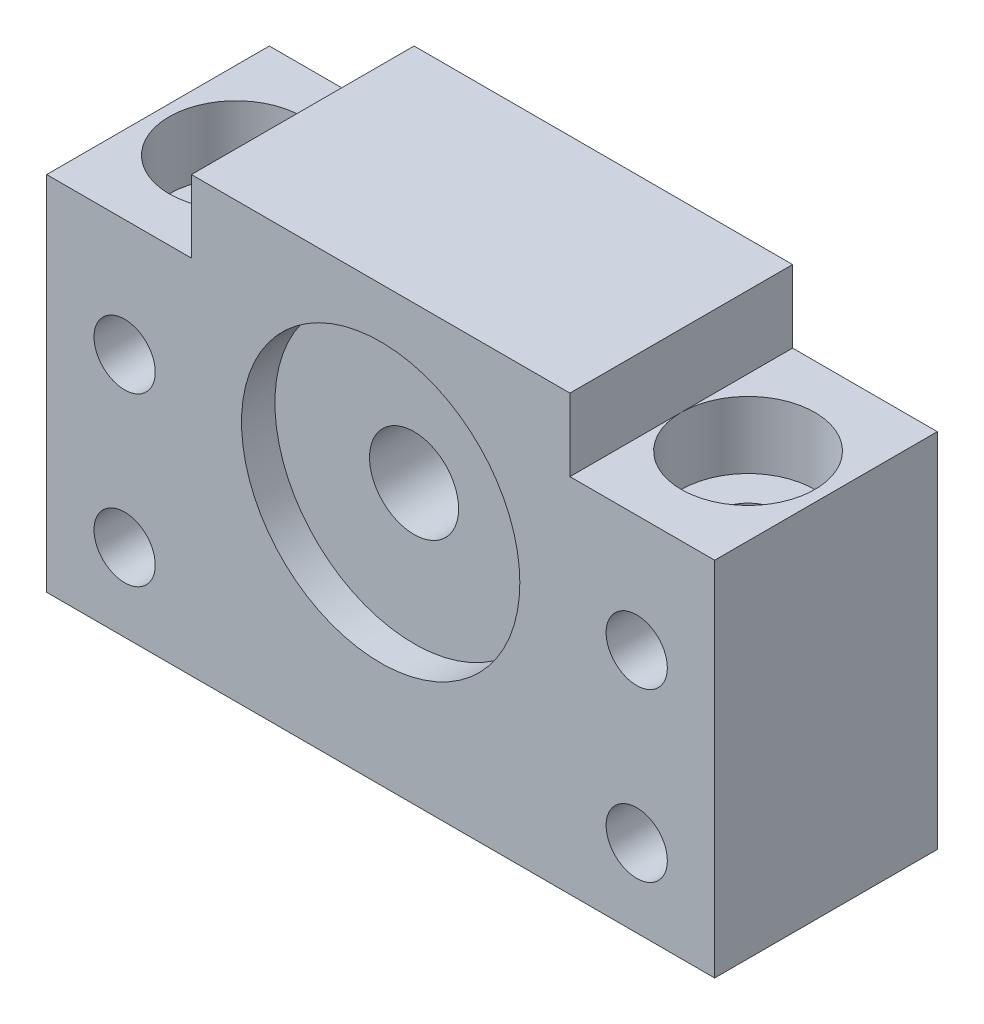
ISO-10303-21;
HEADER;
FILE_DESCRIPTION(('STEP AP214'),'2;1');
FILE_NAME('part.step','',(''),(''),'','','');
FILE_SCHEMA(('AUTOMOTIVE_DESIGN { 1 0 10303 214 1 1 1 1 }'));
ENDSEC;
DATA;
#1=APPLICATION_CONTEXT('core data for automotive mechanical design processes');
#2=APPLICATION_PROTOCOL_DEFINITION('international standard','automotive_design',2000,#1);
#3=PRODUCT_CONTEXT('',#1,'mechanical');
#4=PRODUCT('Part','Part','',(#3));
#5=PRODUCT_RELATED_PRODUCT_CATEGORY('part','',(#4));
#6=PRODUCT_DEFINITION_FORMATION('','',#4);
#7=PRODUCT_DEFINITION_CONTEXT('part definition',#1,'design');
#8=PRODUCT_DEFINITION('design','',#6,#7);
#9=PRODUCT_DEFINITION_SHAPE('','',#8);
#10=(LENGTH_UNIT() NAMED_UNIT(*) SI_UNIT(.MILLI.,.METRE.));
#11=(NAMED_UNIT(*) PLANE_ANGLE_UNIT() SI_UNIT($,.RADIAN.));
#12=(NAMED_UNIT(*) SI_UNIT($,.STERADIAN.) SOLID_ANGLE_UNIT());
#13=UNCERTAINTY_MEASURE_WITH_UNIT(LENGTH_MEASURE(1.E-05),#10,'distance_accuracy_value','');
#14=(GEOMETRIC_REPRESENTATION_CONTEXT(3) GLOBAL_UNCERTAINTY_ASSIGNED_CONTEXT((#13)) GLOBAL_UNIT_ASSIGNED_CONTEXT((#10,
#11,#12)) REPRESENTATION_CONTEXT('',''));
#15=CARTESIAN_POINT('',(0.,0.,0.));
#16=DIRECTION('',(0.,0.,1.));
#17=DIRECTION('',(1.,0.,0.));
#18=AXIS2_PLACEMENT_3D('',#15,#16,#17);
#19=CARTESIAN_POINT('',(53.,0.,10.));
#20=DIRECTION('',(0.,1.,0.));
#21=DIRECTION('',(-1.,0.,0.));
#22=AXIS2_PLACEMENT_3D('',#19,#20,#21);
#23=CYLINDRICAL_SURFACE('',#22,2.75);
#24=CARTESIAN_POINT('',(53.,22.,10.));
#25=DIRECTION('',(0.,-0.707106781186547,0.707106781186547));
#26=DIRECTION('',(0.,0.707106781186547,0.707106781186547));
#27=AXIS2_PLACEMENT_3D('',#24,#25,#26);
#28=ELLIPSE('',#27,3.88908729652601,2.75);
#29=CARTESIAN_POINT('',(50.25,22.,10.));
#30=VERTEX_POINT('',#29);
#31=CARTESIAN_POINT('',(55.75,22.,10.));
#32=VERTEX_POINT('',#31);
#33=EDGE_CURVE('E155',#30,#32,#28,.F.);
#34=ORIENTED_EDGE('',*,*,#33,.F.);
#35=CARTESIAN_POINT('',(53.,22.,10.));
#36=DIRECTION('',(0.,0.707106781186547,0.707106781186547));
#37=DIRECTION('',(0.,-0.707106781186547,0.707106781186547));
#38=AXIS2_PLACEMENT_3D('',#35,#36,#37);
#39=ELLIPSE('',#38,3.88908729652601,2.75);
#40=EDGE_CURVE('E169',#32,#30,#39,.T.);
#41=ORIENTED_EDGE('',*,*,#40,.F.);
#42=EDGE_LOOP('',(#34,#41));
#43=FACE_BOUND('',#42,.T.);
#44=CARTESIAN_POINT('',(53.,26.5,10.));
#45=DIRECTION('',(0.,1.,0.));
#46=DIRECTION('',(-1.,0.,0.));
#47=AXIS2_PLACEMENT_3D('',#44,#45,#46);
#48=CIRCLE('',#47,2.75);
#49=CARTESIAN_POINT('',(50.25,26.5,10.));
#50=VERTEX_POINT('',#49);
#51=EDGE_CURVE('E39',#50,#50,#48,.F.);
#52=ORIENTED_EDGE('',*,*,#51,.F.);
#53=EDGE_LOOP('',(#52));
#54=FACE_BOUND('',#53,.T.);
#55=ADVANCED_FACE('F35',(#43,#54),#23,.F.);
#56=CARTESIAN_POINT('',(6.99999999999998,0.,10.));
#57=DIRECTION('',(0.,1.,0.));
#58=DIRECTION('',(-1.,0.,0.));
#59=AXIS2_PLACEMENT_3D('',#56,#57,#58);
#60=CYLINDRICAL_SURFACE('',#59,2.75);
#61=CARTESIAN_POINT('',(6.99999999999999,22.,10.));
#62=DIRECTION('',(0.,-0.707106781186547,0.707106781186547));
#63=DIRECTION('',(0.,0.707106781186547,0.707106781186547));
#64=AXIS2_PLACEMENT_3D('',#61,#62,#63);
#65=ELLIPSE('',#64,3.88908729652601,2.75);
#66=CARTESIAN_POINT('',(4.24999999999999,22.,10.));
#67=VERTEX_POINT('',#66);
#68=CARTESIAN_POINT('',(9.74999999999999,22.,10.));
#69=VERTEX_POINT('',#68);
#70=EDGE_CURVE('E178',#67,#69,#65,.F.);
#71=ORIENTED_EDGE('',*,*,#70,.F.);
#72=CARTESIAN_POINT('',(6.99999999999999,22.,10.));
#73=DIRECTION('',(0.,0.707106781186547,0.707106781186547));
#74=DIRECTION('',(0.,-0.707106781186547,0.707106781186547));
#75=AXIS2_PLACEMENT_3D('',#72,#73,#74);
#76=ELLIPSE('',#75,3.88908729652601,2.75);
#77=EDGE_CURVE('E183',#69,#67,#76,.T.);
#78=ORIENTED_EDGE('',*,*,#77,.F.);
#79=EDGE_LOOP('',(#71,#78));
#80=FACE_BOUND('',#79,.T.);
#81=CARTESIAN_POINT('',(6.99999999999999,26.5,10.));
#82=DIRECTION('',(0.,1.,0.));
#83=DIRECTION('',(-1.,0.,0.));
#84=AXIS2_PLACEMENT_3D('',#81,#82,#83);
#85=CIRCLE('',#84,2.75);
#86=CARTESIAN_POINT('',(4.25,26.5,10.));
#87=VERTEX_POINT('',#86);
#88=EDGE_CURVE('E148',#87,#87,#85,.F.);
#89=ORIENTED_EDGE('',*,*,#88,.F.);
#90=EDGE_LOOP('',(#89));
#91=FACE_BOUND('',#90,.T.);
#92=ADVANCED_FACE('F312',(#80,#91),#60,.F.);
#93=CARTESIAN_POINT('',(53.,22.,0.));
#94=DIRECTION('',(0.,0.,1.));
#95=DIRECTION('',(1.,0.,0.));
#96=AXIS2_PLACEMENT_3D('',#93,#94,#95);
#97=CYLINDRICAL_SURFACE('',#96,2.75);
#98=CARTESIAN_POINT('',(53.,22.,20.));
#99=DIRECTION('',(0.,0.,1.));
#100=DIRECTION('',(1.,0.,0.));
#101=AXIS2_PLACEMENT_3D('',#98,#99,#100);
#102=CIRCLE('',#101,2.75);
#103=CARTESIAN_POINT('',(55.75,22.,20.));
#104=VERTEX_POINT('',#103);
#105=EDGE_CURVE('E199',#104,#104,#102,.T.);
#106=ORIENTED_EDGE('',*,*,#105,.T.);
#107=EDGE_LOOP('',(#106));
#108=FACE_BOUND('',#107,.T.);
#109=ORIENTED_EDGE('',*,*,#33,.T.);
#110=CARTESIAN_POINT('',(53.,22.,10.));
#111=DIRECTION('',(0.,0.707106781186547,0.707106781186547));
#112=DIRECTION('',(0.,-0.707106781186547,0.707106781186547));
#113=AXIS2_PLACEMENT_3D('',#110,#111,#112);
#114=ELLIPSE('',#113,3.88908729652601,2.75);
#115=EDGE_CURVE('E172',#32,#30,#114,.F.);
#116=ORIENTED_EDGE('',*,*,#115,.T.);
#117=EDGE_LOOP('',(#109,#116));
#118=FACE_BOUND('',#117,.T.);
#119=ADVANCED_FACE('F388',(#108,#118),#97,.F.);
#120=CARTESIAN_POINT('',(53.,7.00000000000001,0.));
#121=DIRECTION('',(0.,0.,1.));
#122=DIRECTION('',(1.,0.,0.));
#123=AXIS2_PLACEMENT_3D('',#120,#121,#122);
#124=CYLINDRICAL_SURFACE('',#123,2.75);
#125=CARTESIAN_POINT('',(53.,7.00000000000001,20.));
#126=DIRECTION('',(0.,0.,1.));
#127=DIRECTION('',(1.,0.,0.));
#128=AXIS2_PLACEMENT_3D('',#125,#126,#127);
#129=CIRCLE('',#128,2.75);
#130=CARTESIAN_POINT('',(55.75,7.00000000000001,20.));
#131=VERTEX_POINT('',#130);
#132=EDGE_CURVE('E200',#131,#131,#129,.T.);
#133=ORIENTED_EDGE('',*,*,#132,.T.);
#134=EDGE_LOOP('',(#133));
#135=FACE_BOUND('',#134,.T.);
#136=CARTESIAN_POINT('',(53.,7.00000000000001,10.));
#137=DIRECTION('',(0.,-0.707106781186547,0.707106781186547));
#138=DIRECTION('',(0.,0.707106781186547,0.707106781186547));
#139=AXIS2_PLACEMENT_3D('',#136,#137,#138);
#140=ELLIPSE('',#139,3.88908729652601,2.75);
#141=CARTESIAN_POINT('',(50.25,7.00000000000001,10.));
#142=VERTEX_POINT('',#141);
#143=CARTESIAN_POINT('',(55.75,7.,10.));
#144=VERTEX_POINT('',#143);
#145=EDGE_CURVE('E135',#142,#144,#140,.F.);
#146=ORIENTED_EDGE('',*,*,#145,.T.);
#147=CARTESIAN_POINT('',(53.,7.00000000000001,10.));
#148=DIRECTION('',(0.,0.707106781186547,0.707106781186547));
#149=DIRECTION('',(0.,-0.707106781186547,0.707106781186547));
#150=AXIS2_PLACEMENT_3D('',#147,#148,#149);
#151=ELLIPSE('',#150,3.88908729652601,2.75);
#152=EDGE_CURVE('E11',#144,#142,#151,.F.);
#153=ORIENTED_EDGE('',*,*,#152,.T.);
#154=EDGE_LOOP('',(#146,#153));
#155=FACE_BOUND('',#154,.T.);
#156=ADVANCED_FACE('F144',(#135,#155),#124,.F.);
#157=CARTESIAN_POINT('',(6.99999999999999,22.,0.));
#158=DIRECTION('',(0.,0.,1.));
#159=DIRECTION('',(1.,0.,0.));
#160=AXIS2_PLACEMENT_3D('',#157,#158,#159);
#161=CYLINDRICAL_SURFACE('',#160,2.75);
#162=CARTESIAN_POINT('',(6.99999999999999,22.,20.));
#163=DIRECTION('',(0.,0.,1.));
#164=DIRECTION('',(1.,0.,0.));
#165=AXIS2_PLACEMENT_3D('',#162,#163,#164);
#166=CIRCLE('',#165,2.75);
#167=CARTESIAN_POINT('',(9.74999999999999,22.,20.));
#168=VERTEX_POINT('',#167);
#169=EDGE_CURVE('E209',#168,#168,#166,.T.);
#170=ORIENTED_EDGE('',*,*,#169,.T.);
#171=EDGE_LOOP('',(#170));
#172=FACE_BOUND('',#171,.T.);
#173=ORIENTED_EDGE('',*,*,#70,.T.);
#174=CARTESIAN_POINT('',(6.99999999999999,22.,10.));
#175=DIRECTION('',(0.,0.707106781186547,0.707106781186547));
#176=DIRECTION('',(0.,-0.707106781186547,0.707106781186547));
#177=AXIS2_PLACEMENT_3D('',#174,#175,#176);
#178=ELLIPSE('',#177,3.88908729652601,2.75);
#179=EDGE_CURVE('E186',#69,#67,#178,.F.);
#180=ORIENTED_EDGE('',*,*,#179,.T.);
#181=EDGE_LOOP('',(#173,#180));
#182=FACE_BOUND('',#181,.T.);
#183=ADVANCED_FACE('F320',(#172,#182),#161,.F.);
#184=CARTESIAN_POINT('',(6.99999999999999,7.,0.));
#185=DIRECTION('',(0.,0.,1.));
#186=DIRECTION('',(1.,0.,0.));
#187=AXIS2_PLACEMENT_3D('',#184,#185,#186);
#188=CYLINDRICAL_SURFACE('',#187,2.75);
#189=CARTESIAN_POINT('',(6.99999999999999,7.,20.));
#190=DIRECTION('',(0.,0.,1.));
#191=DIRECTION('',(1.,0.,0.));
#192=AXIS2_PLACEMENT_3D('',#189,#190,#191);
#193=CIRCLE('',#192,2.75);
#194=CARTESIAN_POINT('',(9.74999999999999,7.,20.));
#195=VERTEX_POINT('',#194);
#196=EDGE_CURVE('E210',#195,#195,#193,.T.);
#197=ORIENTED_EDGE('',*,*,#196,.T.);
#198=EDGE_LOOP('',(#197));
#199=FACE_BOUND('',#198,.T.);
#200=CARTESIAN_POINT('',(6.99999999999999,7.,10.));
#201=DIRECTION('',(0.,-0.707106781186547,0.707106781186547));
#202=DIRECTION('',(0.,0.707106781186547,0.707106781186547));
#203=AXIS2_PLACEMENT_3D('',#200,#201,#202);
#204=ELLIPSE('',#203,3.88908729652601,2.75);
#205=CARTESIAN_POINT('',(4.24999999999999,7.,10.));
#206=VERTEX_POINT('',#205);
#207=CARTESIAN_POINT('',(9.74999999999999,6.99999999999999,10.));
#208=VERTEX_POINT('',#207);
#209=EDGE_CURVE('E285',#206,#208,#204,.F.);
#210=ORIENTED_EDGE('',*,*,#209,.T.);
#211=CARTESIAN_POINT('',(6.99999999999999,7.,10.));
#212=DIRECTION('',(0.,0.707106781186547,0.707106781186547));
#213=DIRECTION('',(0.,-0.707106781186547,0.707106781186547));
#214=AXIS2_PLACEMENT_3D('',#211,#212,#213);
#215=ELLIPSE('',#214,3.88908729652601,2.75);
#216=EDGE_CURVE('E142',#208,#206,#215,.F.);
#217=ORIENTED_EDGE('',*,*,#216,.T.);
#218=EDGE_LOOP('',(#210,#217));
#219=FACE_BOUND('',#218,.T.);
#220=ADVANCED_FACE('F298',(#199,#219),#188,.F.);
#221=CARTESIAN_POINT('',(30.,22.,0.));
#222=DIRECTION('',(0.,0.,1.));
#223=DIRECTION('',(1.,0.,0.));
#224=AXIS2_PLACEMENT_3D('',#221,#222,#223);
#225=CYLINDRICAL_SURFACE('',#224,4.);
#226=CARTESIAN_POINT('',(30.,22.,0.));
#227=DIRECTION('',(0.,0.,1.));
#228=DIRECTION('',(1.,0.,0.));
#229=AXIS2_PLACEMENT_3D('',#226,#227,#228);
#230=CIRCLE('',#229,4.);
#231=CARTESIAN_POINT('',(34.,22.,0.));
#232=VERTEX_POINT('',#231);
#233=EDGE_CURVE('E203',#232,#232,#230,.T.);
#234=ORIENTED_EDGE('',*,*,#233,.F.);
#235=EDGE_LOOP('',(#234));
#236=FACE_BOUND('',#235,.T.);
#237=CARTESIAN_POINT('',(30.,22.,17.));
#238=DIRECTION('',(0.,0.,1.));
#239=DIRECTION('',(1.,0.,0.));
#240=AXIS2_PLACEMENT_3D('',#237,#238,#239);
#241=CIRCLE('',#240,4.);
#242=CARTESIAN_POINT('',(34.,22.,17.));
#243=VERTEX_POINT('',#242);
#244=EDGE_CURVE('E193',#243,#243,#241,.F.);
#245=ORIENTED_EDGE('',*,*,#244,.F.);
#246=EDGE_LOOP('',(#245));
#247=FACE_BOUND('',#246,.T.);
#248=ADVANCED_FACE('F413',(#236,#247),#225,.F.);
#249=CARTESIAN_POINT('',(0.,0.,20.));
#250=DIRECTION('',(1.,0.,0.));
#251=DIRECTION('',(0.,0.,-1.));
#252=AXIS2_PLACEMENT_3D('',#249,#250,#251);
#253=PLANE('',#252);
#254=DIRECTION('',(0.,-1.,0.));
#255=VECTOR('',#254,1.);
#256=CARTESIAN_POINT('',(0.,0.,0.));
#257=LINE('',#256,#255);
#258=CARTESIAN_POINT('',(0.,32.5,0.));
#259=VERTEX_POINT('',#258);
#260=CARTESIAN_POINT('',(0.,0.,0.));
#261=VERTEX_POINT('',#260);
#262=EDGE_CURVE('E221',#259,#261,#257,.T.);
#263=ORIENTED_EDGE('',*,*,#262,.T.);
#264=DIRECTION('',(0.,0.,-1.));
#265=VECTOR('',#264,1.);
#266=CARTESIAN_POINT('',(0.,0.,20.));
#267=LINE('',#266,#265);
#268=CARTESIAN_POINT('',(0.,0.,20.));
#269=VERTEX_POINT('',#268);
#270=EDGE_CURVE('E282',#269,#261,#267,.T.);
#271=ORIENTED_EDGE('',*,*,#270,.F.);
#272=DIRECTION('',(0.,-1.,0.));
#273=VECTOR('',#272,1.);
#274=CARTESIAN_POINT('',(0.,0.,20.));
#275=LINE('',#274,#273);
#276=CARTESIAN_POINT('',(0.,32.5,20.));
#277=VERTEX_POINT('',#276);
#278=EDGE_CURVE('E224',#277,#269,#275,.T.);
#279=ORIENTED_EDGE('',*,*,#278,.F.);
#280=DIRECTION('',(0.,0.,-1.));
#281=VECTOR('',#280,1.);
#282=CARTESIAN_POINT('',(0.,32.5,20.));
#283=LINE('',#282,#281);
#284=EDGE_CURVE('E242',#277,#259,#283,.T.);
#285=ORIENTED_EDGE('',*,*,#284,.T.);
#286=EDGE_LOOP('',(#263,#271,#279,#285));
#287=FACE_BOUND('',#286,.T.);
#288=ADVANCED_FACE('F37',(#287),#253,.F.);
#289=CARTESIAN_POINT('',(0.,0.,20.));
#290=DIRECTION('',(0.,1.,0.));
#291=DIRECTION('',(0.,0.,1.));
#292=AXIS2_PLACEMENT_3D('',#289,#290,#291);
#293=PLANE('',#292);
#294=CARTESIAN_POINT('',(53.,0.,10.));
#295=DIRECTION('',(0.,1.,0.));
#296=DIRECTION('',(-1.,0.,0.));
#297=AXIS2_PLACEMENT_3D('',#294,#295,#296);
#298=CIRCLE('',#297,2.75);
#299=CARTESIAN_POINT('',(50.25,0.,10.));
#300=VERTEX_POINT('',#299);
#301=EDGE_CURVE('E150',#300,#300,#298,.T.);
#302=ORIENTED_EDGE('',*,*,#301,.T.);
#303=EDGE_LOOP('',(#302));
#304=FACE_BOUND('',#303,.T.);
#305=CARTESIAN_POINT('',(6.99999999999998,0.,10.));
#306=DIRECTION('',(0.,1.,0.));
#307=DIRECTION('',(-1.,0.,0.));
#308=AXIS2_PLACEMENT_3D('',#305,#306,#307);
#309=CIRCLE('',#308,2.75);
#310=CARTESIAN_POINT('',(4.24999999999998,0.,10.));
#311=VERTEX_POINT('',#310);
#312=EDGE_CURVE('E175',#311,#311,#309,.T.);
#313=ORIENTED_EDGE('',*,*,#312,.T.);
#314=EDGE_LOOP('',(#313));
#315=FACE_BOUND('',#314,.T.);
#316=DIRECTION('',(1.,0.,0.));
#317=VECTOR('',#316,1.);
#318=CARTESIAN_POINT('',(0.,0.,0.));
#319=LINE('',#318,#317);
#320=CARTESIAN_POINT('',(60.,0.,0.));
#321=VERTEX_POINT('',#320);
#322=EDGE_CURVE('E245',#261,#321,#319,.T.);
#323=ORIENTED_EDGE('',*,*,#322,.T.);
#324=DIRECTION('',(0.,0.,-1.));
#325=VECTOR('',#324,1.);
#326=CARTESIAN_POINT('',(60.,0.,20.));
#327=LINE('',#326,#325);
#328=CARTESIAN_POINT('',(60.,0.,20.));
#329=VERTEX_POINT('',#328);
#330=EDGE_CURVE('E279',#329,#321,#327,.T.);
#331=ORIENTED_EDGE('',*,*,#330,.F.);
#332=DIRECTION('',(1.,0.,0.));
#333=VECTOR('',#332,1.);
#334=CARTESIAN_POINT('',(0.,0.,20.));
#335=LINE('',#334,#333);
#336=EDGE_CURVE('E227',#269,#329,#335,.T.);
#337=ORIENTED_EDGE('',*,*,#336,.F.);
#338=ORIENTED_EDGE('',*,*,#270,.T.);
#339=EDGE_LOOP('',(#323,#331,#337,#338));
#340=FACE_BOUND('',#339,.T.);
#341=ADVANCED_FACE('F371',(#304,#315,#340),#293,.F.);
#342=CARTESIAN_POINT('',(60.,0.,20.));
#343=DIRECTION('',(-1.,0.,0.));
#344=DIRECTION('',(0.,0.,1.));
#345=AXIS2_PLACEMENT_3D('',#342,#343,#344);
#346=PLANE('',#345);
#347=DIRECTION('',(0.,1.,0.));
#348=VECTOR('',#347,1.);
#349=CARTESIAN_POINT('',(60.,0.,0.));
#350=LINE('',#349,#348);
#351=CARTESIAN_POINT('',(60.,32.5,0.));
#352=VERTEX_POINT('',#351);
#353=EDGE_CURVE('E247',#321,#352,#350,.T.);
#354=ORIENTED_EDGE('',*,*,#353,.T.);
#355=DIRECTION('',(0.,0.,-1.));
#356=VECTOR('',#355,1.);
#357=CARTESIAN_POINT('',(60.,32.5,20.));
#358=LINE('',#357,#356);
#359=CARTESIAN_POINT('',(60.,32.5,20.));
#360=VERTEX_POINT('',#359);
#361=EDGE_CURVE('E276',#360,#352,#358,.T.);
#362=ORIENTED_EDGE('',*,*,#361,.F.);
#363=DIRECTION('',(0.,1.,0.));
#364=VECTOR('',#363,1.);
#365=CARTESIAN_POINT('',(60.,0.,20.));
#366=LINE('',#365,#364);
#367=EDGE_CURVE('E230',#329,#360,#366,.T.);
#368=ORIENTED_EDGE('',*,*,#367,.F.);
#369=ORIENTED_EDGE('',*,*,#330,.T.);
#370=EDGE_LOOP('',(#354,#362,#368,#369));
#371=FACE_BOUND('',#370,.T.);
#372=ADVANCED_FACE('F367',(#371),#346,.F.);
#373=CARTESIAN_POINT('',(47.,32.5,20.));
#374=DIRECTION('',(0.,-1.,0.));
#375=DIRECTION('',(1.,0.,0.));
#376=AXIS2_PLACEMENT_3D('',#373,#374,#375);
#377=PLANE('',#376);
#378=DIRECTION('',(0.,0.,-1.));
#379=VECTOR('',#378,1.);
#380=CARTESIAN_POINT('',(47.,32.5,20.));
#381=LINE('',#380,#379);
#382=CARTESIAN_POINT('',(47.,32.5,10.));
#383=VERTEX_POINT('',#382);
#384=CARTESIAN_POINT('',(47.,32.5,0.));
#385=VERTEX_POINT('',#384);
#386=EDGE_CURVE('E272',#383,#385,#381,.T.);
#387=ORIENTED_EDGE('',*,*,#386,.F.);
#388=CARTESIAN_POINT('',(53.,32.5,10.));
#389=DIRECTION('',(0.,1.,0.));
#390=DIRECTION('',(-1.,0.,0.));
#391=AXIS2_PLACEMENT_3D('',#388,#389,#390);
#392=CIRCLE('',#391,6.);
#393=EDGE_CURVE('E50',#383,#383,#392,.T.);
#394=ORIENTED_EDGE('',*,*,#393,.F.);
#395=CARTESIAN_POINT('',(47.,32.5,20.));
#396=VERTEX_POINT('',#395);
#397=EDGE_CURVE('E273',#396,#383,#381,.T.);
#398=ORIENTED_EDGE('',*,*,#397,.F.);
#399=DIRECTION('',(-1.,0.,0.));
#400=VECTOR('',#399,1.);
#401=CARTESIAN_POINT('',(47.,32.5,20.));
#402=LINE('',#401,#400);
#403=EDGE_CURVE('E232',#360,#396,#402,.T.);
#404=ORIENTED_EDGE('',*,*,#403,.F.);
#405=ORIENTED_EDGE('',*,*,#361,.T.);
#406=DIRECTION('',(-1.,0.,0.));
#407=VECTOR('',#406,1.);
#408=CARTESIAN_POINT('',(47.,32.5,0.));
#409=LINE('',#408,#407);
#410=EDGE_CURVE('E249',#352,#385,#409,.T.);
#411=ORIENTED_EDGE('',*,*,#410,.T.);
#412=EDGE_LOOP('',(#387,#394,#398,#404,#405,#411));
#413=FACE_BOUND('',#412,.T.);
#414=ADVANCED_FACE('F363',(#413),#377,.F.);
#415=CARTESIAN_POINT('',(47.,32.5,20.));
#416=DIRECTION('',(-1.,0.,0.));
#417=DIRECTION('',(0.,0.,1.));
#418=AXIS2_PLACEMENT_3D('',#415,#416,#417);
#419=PLANE('',#418);
#420=DIRECTION('',(0.,1.,0.));
#421=VECTOR('',#420,1.);
#422=CARTESIAN_POINT('',(47.,32.5,0.));
#423=LINE('',#422,#421);
#424=CARTESIAN_POINT('',(47.,39.,0.));
#425=VERTEX_POINT('',#424);
#426=EDGE_CURVE('E252',#385,#425,#423,.T.);
#427=ORIENTED_EDGE('',*,*,#426,.T.);
#428=DIRECTION('',(0.,0.,-1.));
#429=VECTOR('',#428,1.);
#430=CARTESIAN_POINT('',(47.,39.,20.));
#431=LINE('',#430,#429);
#432=CARTESIAN_POINT('',(47.,39.,20.));
#433=VERTEX_POINT('',#432);
#434=EDGE_CURVE('E269',#433,#425,#431,.T.);
#435=ORIENTED_EDGE('',*,*,#434,.F.);
#436=DIRECTION('',(0.,1.,0.));
#437=VECTOR('',#436,1.);
#438=CARTESIAN_POINT('',(47.,32.5,20.));
#439=LINE('',#438,#437);
#440=EDGE_CURVE('E234',#396,#433,#439,.T.);
#441=ORIENTED_EDGE('',*,*,#440,.F.);
#442=ORIENTED_EDGE('',*,*,#397,.T.);
#443=ORIENTED_EDGE('',*,*,#386,.T.);
#444=EDGE_LOOP('',(#427,#435,#441,#442,#443));
#445=FACE_BOUND('',#444,.T.);
#446=ADVANCED_FACE('F359',(#445),#419,.F.);
#447=CARTESIAN_POINT('',(13.,39.,20.));
#448=DIRECTION('',(0.,-1.,0.));
#449=DIRECTION('',(1.,0.,0.));
#450=AXIS2_PLACEMENT_3D('',#447,#448,#449);
#451=PLANE('',#450);
#452=DIRECTION('',(-1.,0.,0.));
#453=VECTOR('',#452,1.);
#454=CARTESIAN_POINT('',(13.,39.,0.));
#455=LINE('',#454,#453);
#456=CARTESIAN_POINT('',(13.,39.,0.));
#457=VERTEX_POINT('',#456);
#458=EDGE_CURVE('E254',#425,#457,#455,.T.);
#459=ORIENTED_EDGE('',*,*,#458,.T.);
#460=DIRECTION('',(0.,0.,-1.));
#461=VECTOR('',#460,1.);
#462=CARTESIAN_POINT('',(13.,39.,20.));
#463=LINE('',#462,#461);
#464=CARTESIAN_POINT('',(13.,39.,20.));
#465=VERTEX_POINT('',#464);
#466=EDGE_CURVE('E266',#465,#457,#463,.T.);
#467=ORIENTED_EDGE('',*,*,#466,.F.);
#468=DIRECTION('',(-1.,0.,0.));
#469=VECTOR('',#468,1.);
#470=CARTESIAN_POINT('',(13.,39.,20.));
#471=LINE('',#470,#469);
#472=EDGE_CURVE('E236',#433,#465,#471,.T.);
#473=ORIENTED_EDGE('',*,*,#472,.F.);
#474=ORIENTED_EDGE('',*,*,#434,.T.);
#475=EDGE_LOOP('',(#459,#467,#473,#474));
#476=FACE_BOUND('',#475,.T.);
#477=ADVANCED_FACE('F354',(#476),#451,.F.);
#478=CARTESIAN_POINT('',(13.,32.5,20.));
#479=DIRECTION('',(1.,0.,0.));
#480=DIRECTION('',(0.,0.,-1.));
#481=AXIS2_PLACEMENT_3D('',#478,#479,#480);
#482=PLANE('',#481);
#483=DIRECTION('',(0.,-1.,0.));
#484=VECTOR('',#483,1.);
#485=CARTESIAN_POINT('',(13.,32.5,0.));
#486=LINE('',#485,#484);
#487=CARTESIAN_POINT('',(13.,32.5,0.));
#488=VERTEX_POINT('',#487);
#489=EDGE_CURVE('E256',#457,#488,#486,.T.);
#490=ORIENTED_EDGE('',*,*,#489,.T.);
#491=DIRECTION('',(0.,0.,-1.));
#492=VECTOR('',#491,1.);
#493=CARTESIAN_POINT('',(13.,32.5,20.));
#494=LINE('',#493,#492);
#495=CARTESIAN_POINT('',(13.,32.5,10.));
#496=VERTEX_POINT('',#495);
#497=EDGE_CURVE('E262',#496,#488,#494,.T.);
#498=ORIENTED_EDGE('',*,*,#497,.F.);
#499=CARTESIAN_POINT('',(13.,32.5,20.));
#500=VERTEX_POINT('',#499);
#501=EDGE_CURVE('E263',#500,#496,#494,.T.);
#502=ORIENTED_EDGE('',*,*,#501,.F.);
#503=DIRECTION('',(0.,-1.,0.));
#504=VECTOR('',#503,1.);
#505=CARTESIAN_POINT('',(13.,32.5,20.));
#506=LINE('',#505,#504);
#507=EDGE_CURVE('E238',#465,#500,#506,.T.);
#508=ORIENTED_EDGE('',*,*,#507,.F.);
#509=ORIENTED_EDGE('',*,*,#466,.T.);
#510=EDGE_LOOP('',(#490,#498,#502,#508,#509));
#511=FACE_BOUND('',#510,.T.);
#512=ADVANCED_FACE('F347',(#511),#482,.F.);
#513=CARTESIAN_POINT('',(0.,32.5,20.));
#514=DIRECTION('',(0.,-1.,0.));
#515=DIRECTION('',(0.,0.,-1.));
#516=AXIS2_PLACEMENT_3D('',#513,#514,#515);
#517=PLANE('',#516);
#518=ORIENTED_EDGE('',*,*,#501,.T.);
#519=CARTESIAN_POINT('',(7.,32.5,10.));
#520=DIRECTION('',(0.,1.,0.));
#521=DIRECTION('',(-1.,0.,0.));
#522=AXIS2_PLACEMENT_3D('',#519,#520,#521);
#523=CIRCLE('',#522,6.);
#524=EDGE_CURVE('E55',#496,#496,#523,.T.);
#525=ORIENTED_EDGE('',*,*,#524,.F.);
#526=ORIENTED_EDGE('',*,*,#497,.T.);
#527=DIRECTION('',(-1.,0.,0.));
#528=VECTOR('',#527,1.);
#529=CARTESIAN_POINT('',(0.,32.5,0.));
#530=LINE('',#529,#528);
#531=EDGE_CURVE('E228',#488,#259,#530,.T.);
#532=ORIENTED_EDGE('',*,*,#531,.T.);
#533=ORIENTED_EDGE('',*,*,#284,.F.);
#534=DIRECTION('',(-1.,0.,0.));
#535=VECTOR('',#534,1.);
#536=CARTESIAN_POINT('',(0.,32.5,20.));
#537=LINE('',#536,#535);
#538=EDGE_CURVE('E240',#500,#277,#537,.T.);
#539=ORIENTED_EDGE('',*,*,#538,.F.);
#540=EDGE_LOOP('',(#518,#525,#526,#532,#533,#539));
#541=FACE_BOUND('',#540,.T.);
#542=ADVANCED_FACE('F343',(#541),#517,.F.);
#543=CARTESIAN_POINT('',(0.,0.,20.));
#544=DIRECTION('',(0.,0.,-1.));
#545=DIRECTION('',(-1.,0.,0.));
#546=AXIS2_PLACEMENT_3D('',#543,#544,#545);
#547=PLANE('',#546);
#548=CARTESIAN_POINT('',(30.,22.,20.));
#549=DIRECTION('',(0.,0.,1.));
#550=DIRECTION('',(1.,0.,0.));
#551=AXIS2_PLACEMENT_3D('',#548,#549,#550);
#552=CIRCLE('',#551,12.5);
#553=CARTESIAN_POINT('',(42.5,22.,20.));
#554=VERTEX_POINT('',#553);
#555=EDGE_CURVE('E189',#554,#554,#552,.T.);
#556=ORIENTED_EDGE('',*,*,#555,.F.);
#557=EDGE_LOOP('',(#556));
#558=FACE_BOUND('',#557,.T.);
#559=ORIENTED_EDGE('',*,*,#132,.F.);
#560=EDGE_LOOP('',(#559));
#561=FACE_BOUND('',#560,.T.);
#562=ORIENTED_EDGE('',*,*,#105,.F.);
#563=EDGE_LOOP('',(#562));
#564=FACE_BOUND('',#563,.T.);
#565=ORIENTED_EDGE('',*,*,#196,.F.);
#566=EDGE_LOOP('',(#565));
#567=FACE_BOUND('',#566,.T.);
#568=ORIENTED_EDGE('',*,*,#169,.F.);
#569=EDGE_LOOP('',(#568));
#570=FACE_BOUND('',#569,.T.);
#571=ORIENTED_EDGE('',*,*,#278,.T.);
#572=ORIENTED_EDGE('',*,*,#336,.T.);
#573=ORIENTED_EDGE('',*,*,#367,.T.);
#574=ORIENTED_EDGE('',*,*,#403,.T.);
#575=ORIENTED_EDGE('',*,*,#440,.T.);
#576=ORIENTED_EDGE('',*,*,#472,.T.);
#577=ORIENTED_EDGE('',*,*,#507,.T.);
#578=ORIENTED_EDGE('',*,*,#538,.T.);
#579=EDGE_LOOP('',(#571,#572,#573,#574,#575,#576,#577,#578));
#580=FACE_BOUND('',#579,.T.);
#581=ADVANCED_FACE('F330',(#558,#561,#564,#567,#570,#580),#547,.F.);
#582=CARTESIAN_POINT('',(0.,0.,0.));
#583=DIRECTION('',(0.,0.,-1.));
#584=DIRECTION('',(-1.,0.,0.));
#585=AXIS2_PLACEMENT_3D('',#582,#583,#584);
#586=PLANE('',#585);
#587=ORIENTED_EDGE('',*,*,#233,.T.);
#588=EDGE_LOOP('',(#587));
#589=FACE_BOUND('',#588,.T.);
#590=CARTESIAN_POINT('',(53.,7.00000000000001,0.));
#591=DIRECTION('',(0.,0.,1.));
#592=DIRECTION('',(1.,0.,0.));
#593=AXIS2_PLACEMENT_3D('',#590,#591,#592);
#594=CIRCLE('',#593,2.75);
#595=CARTESIAN_POINT('',(55.75,7.00000000000001,0.));
#596=VERTEX_POINT('',#595);
#597=EDGE_CURVE('E196',#596,#596,#594,.T.);
#598=ORIENTED_EDGE('',*,*,#597,.T.);
#599=EDGE_LOOP('',(#598));
#600=FACE_BOUND('',#599,.T.);
#601=CARTESIAN_POINT('',(53.,22.,0.));
#602=DIRECTION('',(0.,0.,1.));
#603=DIRECTION('',(1.,0.,0.));
#604=AXIS2_PLACEMENT_3D('',#601,#602,#603);
#605=CIRCLE('',#604,2.75);
#606=CARTESIAN_POINT('',(55.75,22.,0.));
#607=VERTEX_POINT('',#606);
#608=EDGE_CURVE('E213',#607,#607,#605,.T.);
#609=ORIENTED_EDGE('',*,*,#608,.T.);
#610=EDGE_LOOP('',(#609));
#611=FACE_BOUND('',#610,.T.);
#612=CARTESIAN_POINT('',(6.99999999999999,7.,0.));
#613=DIRECTION('',(0.,0.,1.));
#614=DIRECTION('',(1.,0.,0.));
#615=AXIS2_PLACEMENT_3D('',#612,#613,#614);
#616=CIRCLE('',#615,2.75);
#617=CARTESIAN_POINT('',(9.74999999999999,7.,0.));
#618=VERTEX_POINT('',#617);
#619=EDGE_CURVE('E206',#618,#618,#616,.T.);
#620=ORIENTED_EDGE('',*,*,#619,.T.);
#621=EDGE_LOOP('',(#620));
#622=FACE_BOUND('',#621,.T.);
#623=CARTESIAN_POINT('',(6.99999999999999,22.,0.));
#624=DIRECTION('',(0.,0.,1.));
#625=DIRECTION('',(1.,0.,0.));
#626=AXIS2_PLACEMENT_3D('',#623,#624,#625);
#627=CIRCLE('',#626,2.75);
#628=CARTESIAN_POINT('',(9.74999999999999,22.,0.));
#629=VERTEX_POINT('',#628);
#630=EDGE_CURVE('E218',#629,#629,#627,.T.);
#631=ORIENTED_EDGE('',*,*,#630,.T.);
#632=EDGE_LOOP('',(#631));
#633=FACE_BOUND('',#632,.T.);
#634=ORIENTED_EDGE('',*,*,#262,.F.);
#635=ORIENTED_EDGE('',*,*,#531,.F.);
#636=ORIENTED_EDGE('',*,*,#489,.F.);
#637=ORIENTED_EDGE('',*,*,#458,.F.);
#638=ORIENTED_EDGE('',*,*,#426,.F.);
#639=ORIENTED_EDGE('',*,*,#410,.F.);
#640=ORIENTED_EDGE('',*,*,#353,.F.);
#641=ORIENTED_EDGE('',*,*,#322,.F.);
#642=EDGE_LOOP('',(#634,#635,#636,#637,#638,#639,#640,#641));
#643=FACE_BOUND('',#642,.T.);
#644=ADVANCED_FACE('F324',(#589,#600,#611,#622,#633,#643),#586,.T.);
#645=CARTESIAN_POINT('',(6.99999999999999,22.,10.));
#646=DIRECTION('',(0.,-0.707106781186547,0.707106781186547));
#647=DIRECTION('',(0.,0.707106781186547,0.707106781186547));
#648=AXIS2_PLACEMENT_3D('',#645,#646,#647);
#649=ELLIPSE('',#648,3.88908729652601,2.75);
#650=EDGE_CURVE('E180',#67,#69,#649,.T.);
#651=ORIENTED_EDGE('',*,*,#650,.T.);
#652=ORIENTED_EDGE('',*,*,#77,.T.);
#653=EDGE_LOOP('',(#651,#652));
#654=FACE_BOUND('',#653,.T.);
#655=ORIENTED_EDGE('',*,*,#630,.F.);
#656=EDGE_LOOP('',(#655));
#657=FACE_BOUND('',#656,.T.);
#658=ADVANCED_FACE('F321',(#654,#657),#161,.F.);
#659=CARTESIAN_POINT('',(6.99999999999999,7.,10.));
#660=DIRECTION('',(0.,-0.707106781186547,0.707106781186547));
#661=DIRECTION('',(0.,0.707106781186547,0.707106781186547));
#662=AXIS2_PLACEMENT_3D('',#659,#660,#661);
#663=ELLIPSE('',#662,3.88908729652601,2.75);
#664=EDGE_CURVE('E289',#206,#208,#663,.T.);
#665=ORIENTED_EDGE('',*,*,#664,.T.);
#666=CARTESIAN_POINT('',(6.99999999999999,7.,10.));
#667=DIRECTION('',(0.,0.707106781186547,0.707106781186547));
#668=DIRECTION('',(0.,-0.707106781186547,0.707106781186547));
#669=AXIS2_PLACEMENT_3D('',#666,#667,#668);
#670=ELLIPSE('',#669,3.88908729652601,2.75);
#671=EDGE_CURVE('E292',#208,#206,#670,.T.);
#672=ORIENTED_EDGE('',*,*,#671,.T.);
#673=EDGE_LOOP('',(#665,#672));
#674=FACE_BOUND('',#673,.T.);
#675=ORIENTED_EDGE('',*,*,#619,.F.);
#676=EDGE_LOOP('',(#675));
#677=FACE_BOUND('',#676,.T.);
#678=ADVANCED_FACE('F303',(#674,#677),#188,.F.);
#679=CARTESIAN_POINT('',(53.,22.,10.));
#680=DIRECTION('',(0.,-0.707106781186547,0.707106781186547));
#681=DIRECTION('',(0.,0.707106781186547,0.707106781186547));
#682=AXIS2_PLACEMENT_3D('',#679,#680,#681);
#683=ELLIPSE('',#682,3.88908729652601,2.75);
#684=EDGE_CURVE('E166',#30,#32,#683,.T.);
#685=ORIENTED_EDGE('',*,*,#684,.T.);
#686=ORIENTED_EDGE('',*,*,#40,.T.);
#687=EDGE_LOOP('',(#685,#686));
#688=FACE_BOUND('',#687,.T.);
#689=ORIENTED_EDGE('',*,*,#608,.F.);
#690=EDGE_LOOP('',(#689));
#691=FACE_BOUND('',#690,.T.);
#692=ADVANCED_FACE('F412',(#688,#691),#97,.F.);
#693=CARTESIAN_POINT('',(53.,7.00000000000001,10.));
#694=DIRECTION('',(0.,-0.707106781186547,0.707106781186547));
#695=DIRECTION('',(0.,0.707106781186547,0.707106781186547));
#696=AXIS2_PLACEMENT_3D('',#693,#694,#695);
#697=ELLIPSE('',#696,3.88908729652601,2.75);
#698=EDGE_CURVE('E130',#142,#144,#697,.T.);
#699=ORIENTED_EDGE('',*,*,#698,.T.);
#700=CARTESIAN_POINT('',(53.,7.00000000000001,10.));
#701=DIRECTION('',(0.,0.707106781186547,0.707106781186547));
#702=DIRECTION('',(0.,-0.707106781186547,0.707106781186547));
#703=AXIS2_PLACEMENT_3D('',#700,#701,#702);
#704=ELLIPSE('',#703,3.88908729652601,2.75);
#705=EDGE_CURVE('E44',#144,#142,#704,.T.);
#706=ORIENTED_EDGE('',*,*,#705,.T.);
#707=EDGE_LOOP('',(#699,#706));
#708=FACE_BOUND('',#707,.T.);
#709=ORIENTED_EDGE('',*,*,#597,.F.);
#710=EDGE_LOOP('',(#709));
#711=FACE_BOUND('',#710,.T.);
#712=ADVANCED_FACE('F145',(#708,#711),#124,.F.);
#713=CARTESIAN_POINT('',(30.,22.,17.));
#714=DIRECTION('',(0.,0.,1.));
#715=DIRECTION('',(1.,0.,0.));
#716=AXIS2_PLACEMENT_3D('',#713,#714,#715);
#717=PLANE('',#716);
#718=CARTESIAN_POINT('',(30.,22.,17.));
#719=DIRECTION('',(0.,0.,1.));
#720=DIRECTION('',(1.,0.,0.));
#721=AXIS2_PLACEMENT_3D('',#718,#719,#720);
#722=CIRCLE('',#721,12.5);
#723=CARTESIAN_POINT('',(42.5,22.,17.));
#724=VERTEX_POINT('',#723);
#725=EDGE_CURVE('E190',#724,#724,#722,.T.);
#726=ORIENTED_EDGE('',*,*,#725,.T.);
#727=EDGE_LOOP('',(#726));
#728=FACE_BOUND('',#727,.T.);
#729=ORIENTED_EDGE('',*,*,#244,.T.);
#730=EDGE_LOOP('',(#729));
#731=FACE_BOUND('',#730,.T.);
#732=ADVANCED_FACE('F403',(#728,#731),#717,.T.);
#733=CARTESIAN_POINT('',(30.,22.,17.));
#734=DIRECTION('',(0.,0.,1.));
#735=DIRECTION('',(1.,0.,0.));
#736=AXIS2_PLACEMENT_3D('',#733,#734,#735);
#737=CYLINDRICAL_SURFACE('',#736,12.5);
#738=ORIENTED_EDGE('',*,*,#725,.F.);
#739=EDGE_LOOP('',(#738));
#740=FACE_BOUND('',#739,.T.);
#741=ORIENTED_EDGE('',*,*,#555,.T.);
#742=EDGE_LOOP('',(#741));
#743=FACE_BOUND('',#742,.T.);
#744=ADVANCED_FACE('F310',(#740,#743),#737,.F.);
#745=ORIENTED_EDGE('',*,*,#209,.F.);
#746=ORIENTED_EDGE('',*,*,#671,.F.);
#747=EDGE_LOOP('',(#745,#746));
#748=FACE_BOUND('',#747,.T.);
#749=ORIENTED_EDGE('',*,*,#650,.F.);
#750=ORIENTED_EDGE('',*,*,#179,.F.);
#751=EDGE_LOOP('',(#749,#750));
#752=FACE_BOUND('',#751,.T.);
#753=ADVANCED_FACE('F306',(#748,#752),#60,.F.);
#754=ORIENTED_EDGE('',*,*,#312,.F.);
#755=EDGE_LOOP('',(#754));
#756=FACE_BOUND('',#755,.T.);
#757=ORIENTED_EDGE('',*,*,#664,.F.);
#758=ORIENTED_EDGE('',*,*,#216,.F.);
#759=EDGE_LOOP('',(#757,#758));
#760=FACE_BOUND('',#759,.T.);
#761=ADVANCED_FACE('F309',(#756,#760),#60,.F.);
#762=ORIENTED_EDGE('',*,*,#145,.F.);
#763=ORIENTED_EDGE('',*,*,#705,.F.);
#764=EDGE_LOOP('',(#762,#763));
#765=FACE_BOUND('',#764,.T.);
#766=ORIENTED_EDGE('',*,*,#684,.F.);
#767=ORIENTED_EDGE('',*,*,#115,.F.);
#768=EDGE_LOOP('',(#766,#767));
#769=FACE_BOUND('',#768,.T.);
#770=ADVANCED_FACE('F139',(#765,#769),#23,.F.);
#771=ORIENTED_EDGE('',*,*,#301,.F.);
#772=EDGE_LOOP('',(#771));
#773=FACE_BOUND('',#772,.T.);
#774=ORIENTED_EDGE('',*,*,#698,.F.);
#775=ORIENTED_EDGE('',*,*,#152,.F.);
#776=EDGE_LOOP('',(#774,#775));
#777=FACE_BOUND('',#776,.T.);
#778=ADVANCED_FACE('F132',(#773,#777),#23,.F.);
#779=CARTESIAN_POINT('',(6.99999999999999,26.5,10.));
#780=DIRECTION('',(0.,1.,0.));
#781=DIRECTION('',(-1.,0.,0.));
#782=AXIS2_PLACEMENT_3D('',#779,#780,#781);
#783=PLANE('',#782);
#784=CARTESIAN_POINT('',(6.99999999999999,26.5,10.));
#785=DIRECTION('',(0.,1.,0.));
#786=DIRECTION('',(-1.,0.,0.));
#787=AXIS2_PLACEMENT_3D('',#784,#785,#786);
#788=CIRCLE('',#787,6.);
#789=CARTESIAN_POINT('',(0.999999999999996,26.5,10.));
#790=VERTEX_POINT('',#789);
#791=EDGE_CURVE('E151',#790,#790,#788,.T.);
#792=ORIENTED_EDGE('',*,*,#791,.T.);
#793=EDGE_LOOP('',(#792));
#794=FACE_BOUND('',#793,.T.);
#795=ORIENTED_EDGE('',*,*,#88,.T.);
#796=EDGE_LOOP('',(#795));
#797=FACE_BOUND('',#796,.T.);
#798=ADVANCED_FACE('F392',(#794,#797),#783,.T.);
#799=CARTESIAN_POINT('',(6.99999999999999,26.5,10.));
#800=DIRECTION('',(0.,1.,0.));
#801=DIRECTION('',(-1.,0.,0.));
#802=AXIS2_PLACEMENT_3D('',#799,#800,#801);
#803=CYLINDRICAL_SURFACE('',#802,6.);
#804=ORIENTED_EDGE('',*,*,#791,.F.);
#805=EDGE_LOOP('',(#804));
#806=FACE_BOUND('',#805,.T.);
#807=ORIENTED_EDGE('',*,*,#524,.T.);
#808=EDGE_LOOP('',(#807));
#809=FACE_BOUND('',#808,.T.);
#810=ADVANCED_FACE('F521',(#806,#809),#803,.F.);
#811=CARTESIAN_POINT('',(53.,26.5,10.));
#812=DIRECTION('',(0.,1.,0.));
#813=DIRECTION('',(-1.,0.,0.));
#814=AXIS2_PLACEMENT_3D('',#811,#812,#813);
#815=PLANE('',#814);
#816=CARTESIAN_POINT('',(53.,26.5,10.));
#817=DIRECTION('',(0.,1.,0.));
#818=DIRECTION('',(-1.,0.,0.));
#819=AXIS2_PLACEMENT_3D('',#816,#817,#818);
#820=CIRCLE('',#819,6.);
#821=CARTESIAN_POINT('',(47.,26.5,10.));
#822=VERTEX_POINT('',#821);
#823=EDGE_CURVE('E373',#822,#822,#820,.T.);
#824=ORIENTED_EDGE('',*,*,#823,.T.);
#825=EDGE_LOOP('',(#824));
#826=FACE_BOUND('',#825,.T.);
#827=ORIENTED_EDGE('',*,*,#51,.T.);
#828=EDGE_LOOP('',(#827));
#829=FACE_BOUND('',#828,.T.);
#830=ADVANCED_FACE('F380',(#826,#829),#815,.T.);
#831=CARTESIAN_POINT('',(53.,26.5,10.));
#832=DIRECTION('',(0.,1.,0.));
#833=DIRECTION('',(-1.,0.,0.));
#834=AXIS2_PLACEMENT_3D('',#831,#832,#833);
#835=CYLINDRICAL_SURFACE('',#834,6.);
#836=ORIENTED_EDGE('',*,*,#823,.F.);
#837=EDGE_LOOP('',(#836));
#838=FACE_BOUND('',#837,.T.);
#839=ORIENTED_EDGE('',*,*,#393,.T.);
#840=EDGE_LOOP('',(#839));
#841=FACE_BOUND('',#840,.T.);
#842=ADVANCED_FACE('F538',(#838,#841),#835,.F.);
#843=CLOSED_SHELL('',(#55,#92,#119,#156,#183,#220,#248,#288,#341,#372,#414,#446,#477,#512,#542,
#581,#644,#658,#678,#692,#712,#732,#744,#753,#761,#770,#778,#798,#810,#830,#842));
#844=MANIFOLD_SOLID_BREP('B2',#843);
#845=ADVANCED_BREP_SHAPE_REPRESENTATION('',(#18,#844),#14);
#846=SHAPE_DEFINITION_REPRESENTATION(#9,#845);
ENDSEC;
END-ISO-10303-21;
